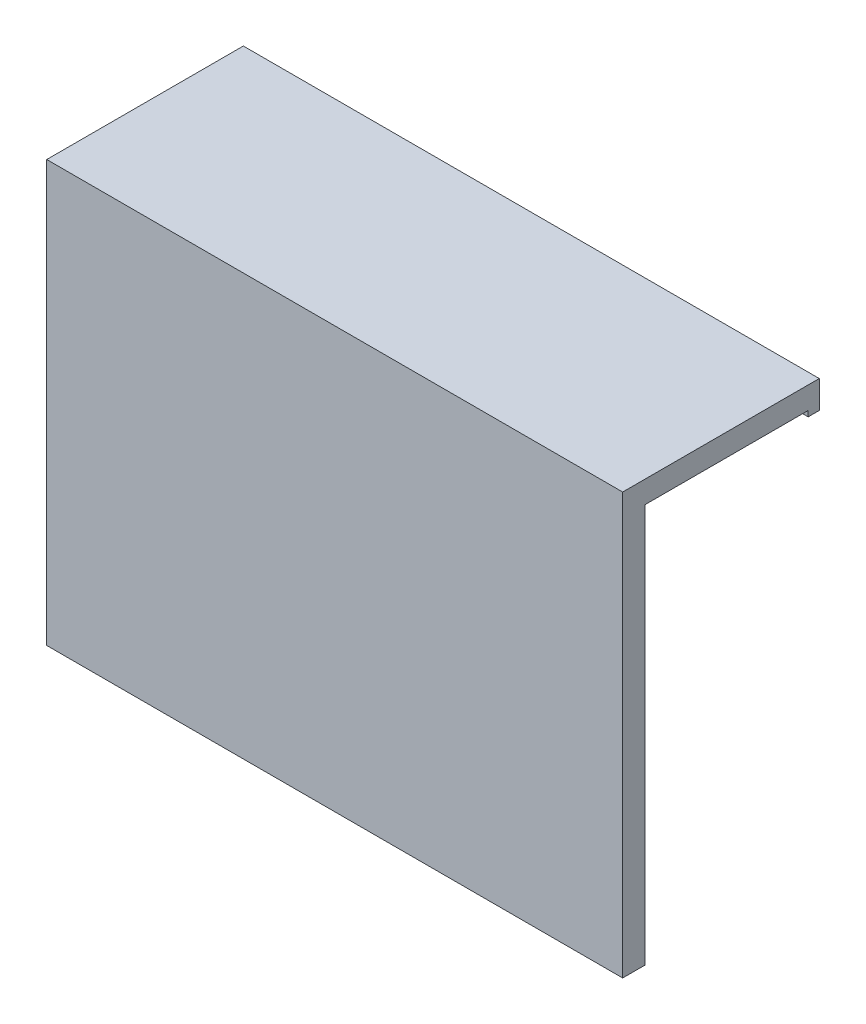
ISO-10303-21;
HEADER;
FILE_DESCRIPTION(('STEP AP214'),'2;1');
FILE_NAME('part.step','',(''),(''),'','','');
FILE_SCHEMA(('AUTOMOTIVE_DESIGN { 1 0 10303 214 1 1 1 1 }'));
ENDSEC;
DATA;
#1=APPLICATION_CONTEXT('core data for automotive mechanical design processes');
#2=APPLICATION_PROTOCOL_DEFINITION('international standard','automotive_design',2000,#1);
#3=PRODUCT_CONTEXT('',#1,'mechanical');
#4=PRODUCT('Part','Part','',(#3));
#5=PRODUCT_RELATED_PRODUCT_CATEGORY('part','',(#4));
#6=PRODUCT_DEFINITION_FORMATION('','',#4);
#7=PRODUCT_DEFINITION_CONTEXT('part definition',#1,'design');
#8=PRODUCT_DEFINITION('design','',#6,#7);
#9=PRODUCT_DEFINITION_SHAPE('','',#8);
#10=(LENGTH_UNIT() NAMED_UNIT(*) SI_UNIT(.MILLI.,.METRE.));
#11=(NAMED_UNIT(*) PLANE_ANGLE_UNIT() SI_UNIT($,.RADIAN.));
#12=(NAMED_UNIT(*) SI_UNIT($,.STERADIAN.) SOLID_ANGLE_UNIT());
#13=UNCERTAINTY_MEASURE_WITH_UNIT(LENGTH_MEASURE(1.E-05),#10,'distance_accuracy_value','');
#14=(GEOMETRIC_REPRESENTATION_CONTEXT(3) GLOBAL_UNCERTAINTY_ASSIGNED_CONTEXT((#13)) GLOBAL_UNIT_ASSIGNED_CONTEXT((#10,
#11,#12)) REPRESENTATION_CONTEXT('',''));
#15=CARTESIAN_POINT('',(0.,0.,0.));
#16=DIRECTION('',(0.,0.,1.));
#17=DIRECTION('',(1.,0.,0.));
#18=AXIS2_PLACEMENT_3D('',#15,#16,#17);
#19=CARTESIAN_POINT('',(0.,0.,-32.5));
#20=DIRECTION('',(0.,0.,-1.));
#21=DIRECTION('',(-1.,0.,0.));
#22=AXIS2_PLACEMENT_3D('',#19,#20,#21);
#23=PLANE('',#22);
#24=DIRECTION('',(0.,1.,0.));
#25=VECTOR('',#24,1.);
#26=CARTESIAN_POINT('',(81.,0.,-32.5));
#27=LINE('',#26,#25);
#28=CARTESIAN_POINT('',(81.,69.8,-32.5));
#29=VERTEX_POINT('',#28);
#30=CARTESIAN_POINT('',(81.,72.,-32.5));
#31=VERTEX_POINT('',#30);
#32=EDGE_CURVE('E190',#29,#31,#27,.T.);
#33=ORIENTED_EDGE('',*,*,#32,.F.);
#34=DIRECTION('',(-1.,0.,0.));
#35=VECTOR('',#34,1.);
#36=CARTESIAN_POINT('',(81.,69.8,-32.5));
#37=LINE('',#36,#35);
#38=CARTESIAN_POINT('',(70.,69.8,-32.5));
#39=VERTEX_POINT('',#38);
#40=EDGE_CURVE('E200',#29,#39,#37,.T.);
#41=ORIENTED_EDGE('',*,*,#40,.T.);
#42=DIRECTION('',(0.,1.,0.));
#43=VECTOR('',#42,1.);
#44=CARTESIAN_POINT('',(70.,0.,-32.5));
#45=LINE('',#44,#43);
#46=CARTESIAN_POINT('',(70.,72.,-32.5));
#47=VERTEX_POINT('',#46);
#48=EDGE_CURVE('E206',#39,#47,#45,.T.);
#49=ORIENTED_EDGE('',*,*,#48,.T.);
#50=DIRECTION('',(-1.,0.,0.));
#51=VECTOR('',#50,1.);
#52=CARTESIAN_POINT('',(0.,72.,-32.5));
#53=LINE('',#52,#51);
#54=CARTESIAN_POINT('',(30.,72.,-32.5));
#55=VERTEX_POINT('',#54);
#56=EDGE_CURVE('E298',#47,#55,#53,.T.);
#57=ORIENTED_EDGE('',*,*,#56,.T.);
#58=DIRECTION('',(0.,1.,0.));
#59=VECTOR('',#58,1.);
#60=CARTESIAN_POINT('',(30.,0.,-32.5));
#61=LINE('',#60,#59);
#62=CARTESIAN_POINT('',(30.,69.8,-32.5));
#63=VERTEX_POINT('',#62);
#64=EDGE_CURVE('E218',#63,#55,#61,.T.);
#65=ORIENTED_EDGE('',*,*,#64,.F.);
#66=DIRECTION('',(1.,0.,0.));
#67=VECTOR('',#66,1.);
#68=CARTESIAN_POINT('',(19.,69.8,-32.5));
#69=LINE('',#68,#67);
#70=CARTESIAN_POINT('',(19.,69.8,-32.5));
#71=VERTEX_POINT('',#70);
#72=EDGE_CURVE('E58',#71,#63,#69,.T.);
#73=ORIENTED_EDGE('',*,*,#72,.F.);
#74=DIRECTION('',(0.,1.,0.));
#75=VECTOR('',#74,1.);
#76=CARTESIAN_POINT('',(19.,0.,-32.5));
#77=LINE('',#76,#75);
#78=CARTESIAN_POINT('',(19.,72.,-32.5));
#79=VERTEX_POINT('',#78);
#80=EDGE_CURVE('E212',#71,#79,#77,.T.);
#81=ORIENTED_EDGE('',*,*,#80,.T.);
#82=CARTESIAN_POINT('',(0.,72.,-32.5));
#83=VERTEX_POINT('',#82);
#84=EDGE_CURVE('E292',#79,#83,#53,.T.);
#85=ORIENTED_EDGE('',*,*,#84,.T.);
#86=DIRECTION('',(0.,-1.,0.));
#87=VECTOR('',#86,1.);
#88=CARTESIAN_POINT('',(0.,70.,-32.5));
#89=LINE('',#88,#87);
#90=CARTESIAN_POINT('',(0.,70.,-32.5));
#91=VERTEX_POINT('',#90);
#92=EDGE_CURVE('E296',#83,#91,#89,.T.);
#93=ORIENTED_EDGE('',*,*,#92,.T.);
#94=DIRECTION('',(-1.,0.,0.));
#95=VECTOR('',#94,1.);
#96=CARTESIAN_POINT('',(-2.,70.,-32.5));
#97=LINE('',#96,#95);
#98=CARTESIAN_POINT('',(-2.,70.,-32.5));
#99=VERTEX_POINT('',#98);
#100=EDGE_CURVE('E302',#91,#99,#97,.T.);
#101=ORIENTED_EDGE('',*,*,#100,.T.);
#102=DIRECTION('',(0.,1.,0.));
#103=VECTOR('',#102,1.);
#104=CARTESIAN_POINT('',(-2.,74.,-32.5));
#105=LINE('',#104,#103);
#106=CARTESIAN_POINT('',(-2.,69.,-32.5));
#107=VERTEX_POINT('',#106);
#108=EDGE_CURVE('E232',#107,#99,#105,.T.);
#109=ORIENTED_EDGE('',*,*,#108,.F.);
#110=DIRECTION('',(-1.,0.,0.));
#111=VECTOR('',#110,1.);
#112=CARTESIAN_POINT('',(102.,69.,-32.5));
#113=LINE('',#112,#111);
#114=CARTESIAN_POINT('',(102.,69.,-32.5));
#115=VERTEX_POINT('',#114);
#116=EDGE_CURVE('E242',#115,#107,#113,.T.);
#117=ORIENTED_EDGE('',*,*,#116,.F.);
#118=DIRECTION('',(0.,-1.,0.));
#119=VECTOR('',#118,1.);
#120=CARTESIAN_POINT('',(102.,74.,-32.5));
#121=LINE('',#120,#119);
#122=CARTESIAN_POINT('',(102.,70.,-32.5));
#123=VERTEX_POINT('',#122);
#124=EDGE_CURVE('E227',#123,#115,#121,.T.);
#125=ORIENTED_EDGE('',*,*,#124,.F.);
#126=DIRECTION('',(-1.,0.,0.));
#127=VECTOR('',#126,1.);
#128=CARTESIAN_POINT('',(100.,70.,-32.5));
#129=LINE('',#128,#127);
#130=CARTESIAN_POINT('',(100.,70.,-32.5));
#131=VERTEX_POINT('',#130);
#132=EDGE_CURVE('E285',#123,#131,#129,.T.);
#133=ORIENTED_EDGE('',*,*,#132,.T.);
#134=DIRECTION('',(0.,1.,0.));
#135=VECTOR('',#134,1.);
#136=CARTESIAN_POINT('',(100.,72.,-32.5));
#137=LINE('',#136,#135);
#138=CARTESIAN_POINT('',(100.,72.,-32.5));
#139=VERTEX_POINT('',#138);
#140=EDGE_CURVE('E288',#131,#139,#137,.T.);
#141=ORIENTED_EDGE('',*,*,#140,.T.);
#142=EDGE_CURVE('E293',#139,#31,#53,.T.);
#143=ORIENTED_EDGE('',*,*,#142,.T.);
#144=EDGE_LOOP('',(#33,#41,#49,#57,#65,#73,#81,#85,#93,#101,#109,#117,#125,#133,#141,#143));
#145=FACE_BOUND('',#144,.T.);
#146=ADVANCED_FACE('F35',(#145),#23,.F.);
#147=CARTESIAN_POINT('',(0.,0.,-3.));
#148=DIRECTION('',(0.,0.,1.));
#149=DIRECTION('',(1.,0.,0.));
#150=AXIS2_PLACEMENT_3D('',#147,#148,#149);
#151=PLANE('',#150);
#152=DIRECTION('',(-1.,0.,0.));
#153=VECTOR('',#152,1.);
#154=CARTESIAN_POINT('',(100.,70.,-3.));
#155=LINE('',#154,#153);
#156=CARTESIAN_POINT('',(102.,70.,-3.));
#157=VERTEX_POINT('',#156);
#158=CARTESIAN_POINT('',(100.,70.,-3.));
#159=VERTEX_POINT('',#158);
#160=EDGE_CURVE('E282',#157,#159,#155,.T.);
#161=ORIENTED_EDGE('',*,*,#160,.F.);
#162=DIRECTION('',(0.,1.,0.));
#163=VECTOR('',#162,1.);
#164=CARTESIAN_POINT('',(102.,0.,-3.));
#165=LINE('',#164,#163);
#166=CARTESIAN_POINT('',(102.,-2.,-3.));
#167=VERTEX_POINT('',#166);
#168=EDGE_CURVE('E328',#167,#157,#165,.T.);
#169=ORIENTED_EDGE('',*,*,#168,.F.);
#170=DIRECTION('',(1.,0.,0.));
#171=VECTOR('',#170,1.);
#172=CARTESIAN_POINT('',(-2.,-2.,-3.));
#173=LINE('',#172,#171);
#174=CARTESIAN_POINT('',(-2.,-2.,-3.));
#175=VERTEX_POINT('',#174);
#176=EDGE_CURVE('E273',#175,#167,#173,.T.);
#177=ORIENTED_EDGE('',*,*,#176,.F.);
#178=DIRECTION('',(0.,1.,0.));
#179=VECTOR('',#178,1.);
#180=CARTESIAN_POINT('',(-2.,0.,-3.));
#181=LINE('',#180,#179);
#182=CARTESIAN_POINT('',(-2.,70.,-3.));
#183=VERTEX_POINT('',#182);
#184=EDGE_CURVE('E331',#175,#183,#181,.T.);
#185=ORIENTED_EDGE('',*,*,#184,.T.);
#186=DIRECTION('',(-1.,0.,0.));
#187=VECTOR('',#186,1.);
#188=CARTESIAN_POINT('',(-2.,70.,-3.));
#189=LINE('',#188,#187);
#190=CARTESIAN_POINT('',(0.,70.,-3.));
#191=VERTEX_POINT('',#190);
#192=EDGE_CURVE('E289',#191,#183,#189,.T.);
#193=ORIENTED_EDGE('',*,*,#192,.F.);
#194=DIRECTION('',(0.,1.,0.));
#195=VECTOR('',#194,1.);
#196=CARTESIAN_POINT('',(0.,0.,-3.));
#197=LINE('',#196,#195);
#198=CARTESIAN_POINT('',(0.,0.,-3.));
#199=VERTEX_POINT('',#198);
#200=EDGE_CURVE('E322',#199,#191,#197,.T.);
#201=ORIENTED_EDGE('',*,*,#200,.F.);
#202=DIRECTION('',(1.,0.,0.));
#203=VECTOR('',#202,1.);
#204=CARTESIAN_POINT('',(-2.,0.,-3.));
#205=LINE('',#204,#203);
#206=CARTESIAN_POINT('',(100.,0.,-3.));
#207=VERTEX_POINT('',#206);
#208=EDGE_CURVE('E269',#199,#207,#205,.T.);
#209=ORIENTED_EDGE('',*,*,#208,.T.);
#210=DIRECTION('',(0.,1.,0.));
#211=VECTOR('',#210,1.);
#212=CARTESIAN_POINT('',(100.,0.,-3.));
#213=LINE('',#212,#211);
#214=EDGE_CURVE('E325',#207,#159,#213,.T.);
#215=ORIENTED_EDGE('',*,*,#214,.T.);
#216=EDGE_LOOP('',(#161,#169,#177,#185,#193,#201,#209,#215));
#217=FACE_BOUND('',#216,.T.);
#218=ADVANCED_FACE('F389',(#217),#151,.F.);
#219=CARTESIAN_POINT('',(102.,0.,1.));
#220=DIRECTION('',(-1.,0.,0.));
#221=DIRECTION('',(0.,0.,1.));
#222=AXIS2_PLACEMENT_3D('',#219,#220,#221);
#223=PLANE('',#222);
#224=DIRECTION('',(0.,1.,0.));
#225=VECTOR('',#224,1.);
#226=CARTESIAN_POINT('',(102.,0.,1.));
#227=LINE('',#226,#225);
#228=CARTESIAN_POINT('',(102.,-2.,1.));
#229=VERTEX_POINT('',#228);
#230=CARTESIAN_POINT('',(102.,74.,1.));
#231=VERTEX_POINT('',#230);
#232=EDGE_CURVE('E350',#229,#231,#227,.T.);
#233=ORIENTED_EDGE('',*,*,#232,.F.);
#234=DIRECTION('',(0.,0.,1.));
#235=VECTOR('',#234,1.);
#236=CARTESIAN_POINT('',(102.,-2.,1.));
#237=LINE('',#236,#235);
#238=EDGE_CURVE('E276',#167,#229,#237,.T.);
#239=ORIENTED_EDGE('',*,*,#238,.F.);
#240=ORIENTED_EDGE('',*,*,#168,.T.);
#241=DIRECTION('',(0.,0.,1.));
#242=VECTOR('',#241,1.);
#243=CARTESIAN_POINT('',(102.,70.,-32.5));
#244=LINE('',#243,#242);
#245=EDGE_CURVE('E318',#123,#157,#244,.T.);
#246=ORIENTED_EDGE('',*,*,#245,.F.);
#247=ORIENTED_EDGE('',*,*,#124,.T.);
#248=DIRECTION('',(0.,0.,1.));
#249=VECTOR('',#248,1.);
#250=CARTESIAN_POINT('',(102.,69.,-34.5));
#251=LINE('',#250,#249);
#252=CARTESIAN_POINT('',(102.,69.,-34.5));
#253=VERTEX_POINT('',#252);
#254=EDGE_CURVE('E248',#253,#115,#251,.T.);
#255=ORIENTED_EDGE('',*,*,#254,.F.);
#256=DIRECTION('',(0.,-1.,0.));
#257=VECTOR('',#256,1.);
#258=CARTESIAN_POINT('',(102.,74.,-34.5));
#259=LINE('',#258,#257);
#260=CARTESIAN_POINT('',(102.,74.,-34.5));
#261=VERTEX_POINT('',#260);
#262=EDGE_CURVE('E228',#261,#253,#259,.T.);
#263=ORIENTED_EDGE('',*,*,#262,.F.);
#264=DIRECTION('',(0.,0.,-1.));
#265=VECTOR('',#264,1.);
#266=CARTESIAN_POINT('',(102.,74.,1.));
#267=LINE('',#266,#265);
#268=EDGE_CURVE('E11',#231,#261,#267,.T.);
#269=ORIENTED_EDGE('',*,*,#268,.F.);
#270=EDGE_LOOP('',(#233,#239,#240,#246,#247,#255,#263,#269));
#271=FACE_BOUND('',#270,.T.);
#272=ADVANCED_FACE('F37',(#271),#223,.F.);
#273=CARTESIAN_POINT('',(0.,74.,1.));
#274=DIRECTION('',(0.,1.,0.));
#275=DIRECTION('',(0.,0.,1.));
#276=AXIS2_PLACEMENT_3D('',#273,#274,#275);
#277=PLANE('',#276);
#278=ORIENTED_EDGE('',*,*,#268,.T.);
#279=DIRECTION('',(1.,0.,0.));
#280=VECTOR('',#279,1.);
#281=CARTESIAN_POINT('',(102.,74.,-34.5));
#282=LINE('',#281,#280);
#283=CARTESIAN_POINT('',(-2.,74.,-34.5));
#284=VERTEX_POINT('',#283);
#285=EDGE_CURVE('E237',#284,#261,#282,.T.);
#286=ORIENTED_EDGE('',*,*,#285,.F.);
#287=DIRECTION('',(0.,0.,-1.));
#288=VECTOR('',#287,1.);
#289=CARTESIAN_POINT('',(-2.,74.,1.));
#290=LINE('',#289,#288);
#291=CARTESIAN_POINT('',(-2.,74.,1.));
#292=VERTEX_POINT('',#291);
#293=EDGE_CURVE('E43',#292,#284,#290,.T.);
#294=ORIENTED_EDGE('',*,*,#293,.F.);
#295=DIRECTION('',(1.,0.,0.));
#296=VECTOR('',#295,1.);
#297=CARTESIAN_POINT('',(0.,74.,1.));
#298=LINE('',#297,#296);
#299=EDGE_CURVE('E352',#292,#231,#298,.T.);
#300=ORIENTED_EDGE('',*,*,#299,.T.);
#301=EDGE_LOOP('',(#278,#286,#294,#300));
#302=FACE_BOUND('',#301,.T.);
#303=ADVANCED_FACE('F371',(#302),#277,.T.);
#304=CARTESIAN_POINT('',(-2.,0.,1.));
#305=DIRECTION('',(-1.,0.,0.));
#306=DIRECTION('',(0.,0.,1.));
#307=AXIS2_PLACEMENT_3D('',#304,#305,#306);
#308=PLANE('',#307);
#309=ORIENTED_EDGE('',*,*,#293,.T.);
#310=DIRECTION('',(0.,1.,0.));
#311=VECTOR('',#310,1.);
#312=CARTESIAN_POINT('',(-2.,74.,-34.5));
#313=LINE('',#312,#311);
#314=CARTESIAN_POINT('',(-2.,69.,-34.5));
#315=VERTEX_POINT('',#314);
#316=EDGE_CURVE('E234',#315,#284,#313,.T.);
#317=ORIENTED_EDGE('',*,*,#316,.F.);
#318=DIRECTION('',(0.,0.,1.));
#319=VECTOR('',#318,1.);
#320=CARTESIAN_POINT('',(-2.,69.,-34.5));
#321=LINE('',#320,#319);
#322=EDGE_CURVE('E240',#315,#107,#321,.T.);
#323=ORIENTED_EDGE('',*,*,#322,.T.);
#324=ORIENTED_EDGE('',*,*,#108,.T.);
#325=DIRECTION('',(0.,0.,1.));
#326=VECTOR('',#325,1.);
#327=CARTESIAN_POINT('',(-2.,70.,-32.5));
#328=LINE('',#327,#326);
#329=EDGE_CURVE('E305',#99,#183,#328,.T.);
#330=ORIENTED_EDGE('',*,*,#329,.T.);
#331=ORIENTED_EDGE('',*,*,#184,.F.);
#332=DIRECTION('',(0.,0.,-1.));
#333=VECTOR('',#332,1.);
#334=CARTESIAN_POINT('',(-2.,-2.,1.));
#335=LINE('',#334,#333);
#336=CARTESIAN_POINT('',(-2.,-2.,1.));
#337=VERTEX_POINT('',#336);
#338=EDGE_CURVE('E270',#337,#175,#335,.T.);
#339=ORIENTED_EDGE('',*,*,#338,.F.);
#340=DIRECTION('',(0.,1.,0.));
#341=VECTOR('',#340,1.);
#342=CARTESIAN_POINT('',(-2.,0.,1.));
#343=LINE('',#342,#341);
#344=EDGE_CURVE('E356',#337,#292,#343,.T.);
#345=ORIENTED_EDGE('',*,*,#344,.T.);
#346=EDGE_LOOP('',(#309,#317,#323,#324,#330,#331,#339,#345));
#347=FACE_BOUND('',#346,.T.);
#348=ADVANCED_FACE('F362',(#347),#308,.T.);
#349=CARTESIAN_POINT('',(0.,0.,1.));
#350=DIRECTION('',(0.,0.,1.));
#351=DIRECTION('',(1.,0.,0.));
#352=AXIS2_PLACEMENT_3D('',#349,#350,#351);
#353=PLANE('',#352);
#354=ORIENTED_EDGE('',*,*,#344,.F.);
#355=DIRECTION('',(-1.,0.,0.));
#356=VECTOR('',#355,1.);
#357=CARTESIAN_POINT('',(-2.,-2.,1.));
#358=LINE('',#357,#356);
#359=EDGE_CURVE('E279',#229,#337,#358,.T.);
#360=ORIENTED_EDGE('',*,*,#359,.F.);
#361=ORIENTED_EDGE('',*,*,#232,.T.);
#362=ORIENTED_EDGE('',*,*,#299,.F.);
#363=EDGE_LOOP('',(#354,#360,#361,#362));
#364=FACE_BOUND('',#363,.T.);
#365=ADVANCED_FACE('F394',(#364),#353,.T.);
#366=CARTESIAN_POINT('',(0.,0.,0.));
#367=DIRECTION('',(0.,0.,1.));
#368=DIRECTION('',(1.,0.,0.));
#369=AXIS2_PLACEMENT_3D('',#366,#367,#368);
#370=PLANE('',#369);
#371=DIRECTION('',(1.,0.,0.));
#372=VECTOR('',#371,1.);
#373=CARTESIAN_POINT('',(0.,0.,0.));
#374=LINE('',#373,#372);
#375=CARTESIAN_POINT('',(0.,0.,0.));
#376=VERTEX_POINT('',#375);
#377=CARTESIAN_POINT('',(39.,0.,0.));
#378=VERTEX_POINT('',#377);
#379=EDGE_CURVE('E353',#376,#378,#374,.T.);
#380=ORIENTED_EDGE('',*,*,#379,.F.);
#381=DIRECTION('',(0.,1.,0.));
#382=VECTOR('',#381,1.);
#383=CARTESIAN_POINT('',(0.,0.,0.));
#384=LINE('',#383,#382);
#385=CARTESIAN_POINT('',(0.,72.,0.));
#386=VERTEX_POINT('',#385);
#387=EDGE_CURVE('E321',#376,#386,#384,.T.);
#388=ORIENTED_EDGE('',*,*,#387,.T.);
#389=DIRECTION('',(1.,0.,0.));
#390=VECTOR('',#389,1.);
#391=CARTESIAN_POINT('',(0.,72.,0.));
#392=LINE('',#391,#390);
#393=CARTESIAN_POINT('',(100.,72.,0.));
#394=VERTEX_POINT('',#393);
#395=EDGE_CURVE('E335',#386,#394,#392,.T.);
#396=ORIENTED_EDGE('',*,*,#395,.T.);
#397=DIRECTION('',(0.,1.,0.));
#398=VECTOR('',#397,1.);
#399=CARTESIAN_POINT('',(100.,0.,0.));
#400=LINE('',#399,#398);
#401=CARTESIAN_POINT('',(100.,0.,0.));
#402=VERTEX_POINT('',#401);
#403=EDGE_CURVE('E326',#402,#394,#400,.T.);
#404=ORIENTED_EDGE('',*,*,#403,.F.);
#405=CARTESIAN_POINT('',(61.,0.,0.));
#406=VERTEX_POINT('',#405);
#407=EDGE_CURVE('E342',#406,#402,#374,.T.);
#408=ORIENTED_EDGE('',*,*,#407,.F.);
#409=DIRECTION('',(1.,0.,0.));
#410=VECTOR('',#409,1.);
#411=CARTESIAN_POINT('',(39.,0.,0.));
#412=LINE('',#411,#410);
#413=EDGE_CURVE('E266',#378,#406,#412,.T.);
#414=ORIENTED_EDGE('',*,*,#413,.F.);
#415=EDGE_LOOP('',(#380,#388,#396,#404,#408,#414));
#416=FACE_BOUND('',#415,.T.);
#417=ADVANCED_FACE('F396',(#416),#370,.F.);
#418=CARTESIAN_POINT('',(100.,0.,-3.));
#419=DIRECTION('',(1.,0.,0.));
#420=DIRECTION('',(0.,0.,-1.));
#421=AXIS2_PLACEMENT_3D('',#418,#419,#420);
#422=PLANE('',#421);
#423=ORIENTED_EDGE('',*,*,#403,.T.);
#424=DIRECTION('',(0.,0.,1.));
#425=VECTOR('',#424,1.);
#426=CARTESIAN_POINT('',(100.,72.,-3.));
#427=LINE('',#426,#425);
#428=EDGE_CURVE('E343',#139,#394,#427,.T.);
#429=ORIENTED_EDGE('',*,*,#428,.F.);
#430=ORIENTED_EDGE('',*,*,#140,.F.);
#431=DIRECTION('',(0.,0.,1.));
#432=VECTOR('',#431,1.);
#433=CARTESIAN_POINT('',(100.,70.,-32.5));
#434=LINE('',#433,#432);
#435=EDGE_CURVE('E315',#131,#159,#434,.T.);
#436=ORIENTED_EDGE('',*,*,#435,.T.);
#437=ORIENTED_EDGE('',*,*,#214,.F.);
#438=DIRECTION('',(0.,0.,1.));
#439=VECTOR('',#438,1.);
#440=CARTESIAN_POINT('',(100.,0.,-3.));
#441=LINE('',#440,#439);
#442=EDGE_CURVE('E339',#207,#402,#441,.T.);
#443=ORIENTED_EDGE('',*,*,#442,.T.);
#444=EDGE_LOOP('',(#423,#429,#430,#436,#437,#443));
#445=FACE_BOUND('',#444,.T.);
#446=ADVANCED_FACE('F402',(#445),#422,.F.);
#447=CARTESIAN_POINT('',(0.,72.,-3.));
#448=DIRECTION('',(0.,-1.,0.));
#449=DIRECTION('',(0.,0.,-1.));
#450=AXIS2_PLACEMENT_3D('',#447,#448,#449);
#451=PLANE('',#450);
#452=ORIENTED_EDGE('',*,*,#395,.F.);
#453=DIRECTION('',(0.,0.,1.));
#454=VECTOR('',#453,1.);
#455=CARTESIAN_POINT('',(0.,72.,-3.));
#456=LINE('',#455,#454);
#457=EDGE_CURVE('E346',#83,#386,#456,.T.);
#458=ORIENTED_EDGE('',*,*,#457,.F.);
#459=ORIENTED_EDGE('',*,*,#84,.F.);
#460=EDGE_CURVE('E299',#55,#79,#53,.T.);
#461=ORIENTED_EDGE('',*,*,#460,.F.);
#462=ORIENTED_EDGE('',*,*,#56,.F.);
#463=EDGE_CURVE('E297',#31,#47,#53,.T.);
#464=ORIENTED_EDGE('',*,*,#463,.F.);
#465=ORIENTED_EDGE('',*,*,#142,.F.);
#466=ORIENTED_EDGE('',*,*,#428,.T.);
#467=EDGE_LOOP('',(#452,#458,#459,#461,#462,#464,#465,#466));
#468=FACE_BOUND('',#467,.T.);
#469=ADVANCED_FACE('F445',(#468),#451,.T.);
#470=CARTESIAN_POINT('',(0.,0.,-3.));
#471=DIRECTION('',(1.,0.,0.));
#472=DIRECTION('',(0.,0.,-1.));
#473=AXIS2_PLACEMENT_3D('',#470,#471,#472);
#474=PLANE('',#473);
#475=ORIENTED_EDGE('',*,*,#387,.F.);
#476=DIRECTION('',(0.,0.,1.));
#477=VECTOR('',#476,1.);
#478=CARTESIAN_POINT('',(0.,0.,-3.));
#479=LINE('',#478,#477);
#480=EDGE_CURVE('E333',#199,#376,#479,.T.);
#481=ORIENTED_EDGE('',*,*,#480,.F.);
#482=ORIENTED_EDGE('',*,*,#200,.T.);
#483=DIRECTION('',(0.,0.,1.));
#484=VECTOR('',#483,1.);
#485=CARTESIAN_POINT('',(0.,70.,-32.5));
#486=LINE('',#485,#484);
#487=EDGE_CURVE('E312',#91,#191,#486,.T.);
#488=ORIENTED_EDGE('',*,*,#487,.F.);
#489=ORIENTED_EDGE('',*,*,#92,.F.);
#490=ORIENTED_EDGE('',*,*,#457,.T.);
#491=EDGE_LOOP('',(#475,#481,#482,#488,#489,#490));
#492=FACE_BOUND('',#491,.T.);
#493=ADVANCED_FACE('F440',(#492),#474,.T.);
#494=CARTESIAN_POINT('',(100.,70.,-32.5));
#495=DIRECTION('',(0.,1.,0.));
#496=DIRECTION('',(0.,0.,1.));
#497=AXIS2_PLACEMENT_3D('',#494,#495,#496);
#498=PLANE('',#497);
#499=ORIENTED_EDGE('',*,*,#160,.T.);
#500=ORIENTED_EDGE('',*,*,#435,.F.);
#501=ORIENTED_EDGE('',*,*,#132,.F.);
#502=ORIENTED_EDGE('',*,*,#245,.T.);
#503=EDGE_LOOP('',(#499,#500,#501,#502));
#504=FACE_BOUND('',#503,.T.);
#505=ADVANCED_FACE('F438',(#504),#498,.F.);
#506=CARTESIAN_POINT('',(-2.,70.,-32.5));
#507=DIRECTION('',(0.,1.,0.));
#508=DIRECTION('',(0.,0.,1.));
#509=AXIS2_PLACEMENT_3D('',#506,#507,#508);
#510=PLANE('',#509);
#511=ORIENTED_EDGE('',*,*,#192,.T.);
#512=ORIENTED_EDGE('',*,*,#329,.F.);
#513=ORIENTED_EDGE('',*,*,#100,.F.);
#514=ORIENTED_EDGE('',*,*,#487,.T.);
#515=EDGE_LOOP('',(#511,#512,#513,#514));
#516=FACE_BOUND('',#515,.T.);
#517=ADVANCED_FACE('F386',(#516),#510,.F.);
#518=CARTESIAN_POINT('',(0.,0.,0.));
#519=DIRECTION('',(0.,-1.,0.));
#520=DIRECTION('',(0.,0.,-1.));
#521=AXIS2_PLACEMENT_3D('',#518,#519,#520);
#522=PLANE('',#521);
#523=ORIENTED_EDGE('',*,*,#379,.T.);
#524=DIRECTION('',(0.,0.,1.));
#525=VECTOR('',#524,1.);
#526=CARTESIAN_POINT('',(39.,0.,0.));
#527=LINE('',#526,#525);
#528=CARTESIAN_POINT('',(39.,0.,-2.4));
#529=VERTEX_POINT('',#528);
#530=EDGE_CURVE('E260',#529,#378,#527,.T.);
#531=ORIENTED_EDGE('',*,*,#530,.F.);
#532=DIRECTION('',(1.,0.,0.));
#533=VECTOR('',#532,1.);
#534=CARTESIAN_POINT('',(39.,0.,-2.4));
#535=LINE('',#534,#533);
#536=CARTESIAN_POINT('',(61.,0.,-2.4));
#537=VERTEX_POINT('',#536);
#538=EDGE_CURVE('E263',#529,#537,#535,.T.);
#539=ORIENTED_EDGE('',*,*,#538,.T.);
#540=DIRECTION('',(0.,0.,1.));
#541=VECTOR('',#540,1.);
#542=CARTESIAN_POINT('',(61.,0.,0.));
#543=LINE('',#542,#541);
#544=EDGE_CURVE('E254',#537,#406,#543,.T.);
#545=ORIENTED_EDGE('',*,*,#544,.T.);
#546=ORIENTED_EDGE('',*,*,#407,.T.);
#547=ORIENTED_EDGE('',*,*,#442,.F.);
#548=ORIENTED_EDGE('',*,*,#208,.F.);
#549=ORIENTED_EDGE('',*,*,#480,.T.);
#550=EDGE_LOOP('',(#523,#531,#539,#545,#546,#547,#548,#549));
#551=FACE_BOUND('',#550,.T.);
#552=ADVANCED_FACE('F432',(#551),#522,.F.);
#553=CARTESIAN_POINT('',(0.,-2.,0.));
#554=DIRECTION('',(0.,-1.,0.));
#555=DIRECTION('',(0.,0.,-1.));
#556=AXIS2_PLACEMENT_3D('',#553,#554,#555);
#557=PLANE('',#556);
#558=ORIENTED_EDGE('',*,*,#338,.T.);
#559=ORIENTED_EDGE('',*,*,#176,.T.);
#560=ORIENTED_EDGE('',*,*,#238,.T.);
#561=ORIENTED_EDGE('',*,*,#359,.T.);
#562=EDGE_LOOP('',(#558,#559,#560,#561));
#563=FACE_BOUND('',#562,.T.);
#564=ADVANCED_FACE('F391',(#563),#557,.T.);
#565=CARTESIAN_POINT('',(39.,0.,-1.2));
#566=DIRECTION('',(1.,0.,0.));
#567=DIRECTION('',(0.,0.,-1.));
#568=AXIS2_PLACEMENT_3D('',#565,#566,#567);
#569=CYLINDRICAL_SURFACE('',#568,1.2);
#570=ORIENTED_EDGE('',*,*,#538,.F.);
#571=CARTESIAN_POINT('',(39.,0.,-1.2));
#572=DIRECTION('',(-1.,0.,0.));
#573=DIRECTION('',(0.,0.,1.));
#574=AXIS2_PLACEMENT_3D('',#571,#572,#573);
#575=CIRCLE('',#574,1.2);
#576=EDGE_CURVE('E257',#378,#529,#575,.F.);
#577=ORIENTED_EDGE('',*,*,#576,.F.);
#578=ORIENTED_EDGE('',*,*,#413,.T.);
#579=CARTESIAN_POINT('',(61.,0.,-1.2));
#580=DIRECTION('',(-1.,0.,0.));
#581=DIRECTION('',(0.,0.,1.));
#582=AXIS2_PLACEMENT_3D('',#579,#580,#581);
#583=CIRCLE('',#582,1.2);
#584=EDGE_CURVE('E251',#406,#537,#583,.F.);
#585=ORIENTED_EDGE('',*,*,#584,.T.);
#586=EDGE_LOOP('',(#570,#577,#578,#585));
#587=FACE_BOUND('',#586,.T.);
#588=ADVANCED_FACE('F425',(#587),#569,.F.);
#589=CARTESIAN_POINT('',(39.,0.,0.));
#590=DIRECTION('',(-1.,0.,0.));
#591=DIRECTION('',(0.,0.,1.));
#592=AXIS2_PLACEMENT_3D('',#589,#590,#591);
#593=PLANE('',#592);
#594=ORIENTED_EDGE('',*,*,#576,.T.);
#595=ORIENTED_EDGE('',*,*,#530,.T.);
#596=EDGE_LOOP('',(#594,#595));
#597=FACE_BOUND('',#596,.T.);
#598=ADVANCED_FACE('F421',(#597),#593,.F.);
#599=CARTESIAN_POINT('',(61.,0.,0.));
#600=DIRECTION('',(-1.,0.,0.));
#601=DIRECTION('',(0.,0.,1.));
#602=AXIS2_PLACEMENT_3D('',#599,#600,#601);
#603=PLANE('',#602);
#604=ORIENTED_EDGE('',*,*,#584,.F.);
#605=ORIENTED_EDGE('',*,*,#544,.F.);
#606=EDGE_LOOP('',(#604,#605));
#607=FACE_BOUND('',#606,.T.);
#608=ADVANCED_FACE('F418',(#607),#603,.T.);
#609=CARTESIAN_POINT('',(102.,69.,-34.5));
#610=DIRECTION('',(0.,1.,0.));
#611=DIRECTION('',(0.,0.,1.));
#612=AXIS2_PLACEMENT_3D('',#609,#610,#611);
#613=PLANE('',#612);
#614=ORIENTED_EDGE('',*,*,#116,.T.);
#615=ORIENTED_EDGE('',*,*,#322,.F.);
#616=DIRECTION('',(-1.,0.,0.));
#617=VECTOR('',#616,1.);
#618=CARTESIAN_POINT('',(102.,69.,-34.5));
#619=LINE('',#618,#617);
#620=EDGE_CURVE('E231',#253,#315,#619,.T.);
#621=ORIENTED_EDGE('',*,*,#620,.F.);
#622=ORIENTED_EDGE('',*,*,#254,.T.);
#623=EDGE_LOOP('',(#614,#615,#621,#622));
#624=FACE_BOUND('',#623,.T.);
#625=ADVANCED_FACE('F380',(#624),#613,.F.);
#626=CARTESIAN_POINT('',(0.,0.,-34.5));
#627=DIRECTION('',(0.,0.,-1.));
#628=DIRECTION('',(-1.,0.,0.));
#629=AXIS2_PLACEMENT_3D('',#626,#627,#628);
#630=PLANE('',#629);
#631=ORIENTED_EDGE('',*,*,#262,.T.);
#632=ORIENTED_EDGE('',*,*,#620,.T.);
#633=ORIENTED_EDGE('',*,*,#316,.T.);
#634=ORIENTED_EDGE('',*,*,#285,.T.);
#635=EDGE_LOOP('',(#631,#632,#633,#634));
#636=FACE_BOUND('',#635,.T.);
#637=ADVANCED_FACE('F368',(#636),#630,.T.);
#638=CARTESIAN_POINT('',(19.,0.,-32.5));
#639=DIRECTION('',(0.,0.,-1.));
#640=DIRECTION('',(-1.,0.,0.));
#641=AXIS2_PLACEMENT_3D('',#638,#639,#640);
#642=PLANE('',#641);
#643=CARTESIAN_POINT('',(19.,72.2,-32.5));
#644=VERTEX_POINT('',#643);
#645=EDGE_CURVE('E216',#79,#644,#77,.T.);
#646=ORIENTED_EDGE('',*,*,#645,.T.);
#647=DIRECTION('',(1.,0.,0.));
#648=VECTOR('',#647,1.);
#649=CARTESIAN_POINT('',(19.,72.2,-32.5));
#650=LINE('',#649,#648);
#651=CARTESIAN_POINT('',(30.,72.2,-32.5));
#652=VERTEX_POINT('',#651);
#653=EDGE_CURVE('E224',#644,#652,#650,.T.);
#654=ORIENTED_EDGE('',*,*,#653,.T.);
#655=EDGE_CURVE('E210',#55,#652,#61,.T.);
#656=ORIENTED_EDGE('',*,*,#655,.F.);
#657=ORIENTED_EDGE('',*,*,#460,.T.);
#658=EDGE_LOOP('',(#646,#654,#656,#657));
#659=FACE_BOUND('',#658,.T.);
#660=ADVANCED_FACE('F472',(#659),#642,.T.);
#661=CARTESIAN_POINT('',(19.,71.,-32.5));
#662=DIRECTION('',(1.,0.,0.));
#663=DIRECTION('',(0.,0.,-1.));
#664=AXIS2_PLACEMENT_3D('',#661,#662,#663);
#665=CYLINDRICAL_SURFACE('',#664,1.20000000000001);
#666=CARTESIAN_POINT('',(30.,71.,-32.5));
#667=DIRECTION('',(-1.,0.,0.));
#668=DIRECTION('',(0.,0.,1.));
#669=AXIS2_PLACEMENT_3D('',#666,#667,#668);
#670=CIRCLE('',#669,1.20000000000001);
#671=EDGE_CURVE('E221',#652,#63,#670,.T.);
#672=ORIENTED_EDGE('',*,*,#671,.F.);
#673=ORIENTED_EDGE('',*,*,#653,.F.);
#674=CARTESIAN_POINT('',(19.,71.,-32.5));
#675=DIRECTION('',(-1.,0.,0.));
#676=DIRECTION('',(0.,0.,1.));
#677=AXIS2_PLACEMENT_3D('',#674,#675,#676);
#678=CIRCLE('',#677,1.20000000000001);
#679=EDGE_CURVE('E215',#644,#71,#678,.T.);
#680=ORIENTED_EDGE('',*,*,#679,.T.);
#681=ORIENTED_EDGE('',*,*,#72,.T.);
#682=EDGE_LOOP('',(#672,#673,#680,#681));
#683=FACE_BOUND('',#682,.T.);
#684=ADVANCED_FACE('F481',(#683),#665,.F.);
#685=CARTESIAN_POINT('',(19.,0.,0.));
#686=DIRECTION('',(-1.,0.,0.));
#687=DIRECTION('',(0.,0.,1.));
#688=AXIS2_PLACEMENT_3D('',#685,#686,#687);
#689=PLANE('',#688);
#690=ORIENTED_EDGE('',*,*,#80,.F.);
#691=ORIENTED_EDGE('',*,*,#679,.F.);
#692=ORIENTED_EDGE('',*,*,#645,.F.);
#693=EDGE_LOOP('',(#690,#691,#692));
#694=FACE_BOUND('',#693,.T.);
#695=ADVANCED_FACE('F476',(#694),#689,.F.);
#696=CARTESIAN_POINT('',(30.,0.,0.));
#697=DIRECTION('',(-1.,0.,0.));
#698=DIRECTION('',(0.,0.,1.));
#699=AXIS2_PLACEMENT_3D('',#696,#697,#698);
#700=PLANE('',#699);
#701=ORIENTED_EDGE('',*,*,#64,.T.);
#702=ORIENTED_EDGE('',*,*,#655,.T.);
#703=ORIENTED_EDGE('',*,*,#671,.T.);
#704=EDGE_LOOP('',(#701,#702,#703));
#705=FACE_BOUND('',#704,.T.);
#706=ADVANCED_FACE('F480',(#705),#700,.T.);
#707=CARTESIAN_POINT('',(81.,0.,-32.5));
#708=DIRECTION('',(0.,0.,1.));
#709=DIRECTION('',(1.,0.,0.));
#710=AXIS2_PLACEMENT_3D('',#707,#708,#709);
#711=PLANE('',#710);
#712=ORIENTED_EDGE('',*,*,#463,.T.);
#713=CARTESIAN_POINT('',(70.,72.2,-32.5));
#714=VERTEX_POINT('',#713);
#715=EDGE_CURVE('E50',#47,#714,#45,.T.);
#716=ORIENTED_EDGE('',*,*,#715,.T.);
#717=DIRECTION('',(-1.,0.,0.));
#718=VECTOR('',#717,1.);
#719=CARTESIAN_POINT('',(81.,72.2,-32.5));
#720=LINE('',#719,#718);
#721=CARTESIAN_POINT('',(81.,72.2,-32.5));
#722=VERTEX_POINT('',#721);
#723=EDGE_CURVE('E196',#722,#714,#720,.T.);
#724=ORIENTED_EDGE('',*,*,#723,.F.);
#725=EDGE_CURVE('E184',#31,#722,#27,.T.);
#726=ORIENTED_EDGE('',*,*,#725,.F.);
#727=EDGE_LOOP('',(#712,#716,#724,#726));
#728=FACE_BOUND('',#727,.T.);
#729=ADVANCED_FACE('F197',(#728),#711,.F.);
#730=CARTESIAN_POINT('',(81.,71.,-32.5));
#731=DIRECTION('',(-1.,0.,0.));
#732=DIRECTION('',(0.,0.,1.));
#733=AXIS2_PLACEMENT_3D('',#730,#731,#732);
#734=CYLINDRICAL_SURFACE('',#733,1.20000000000001);
#735=CARTESIAN_POINT('',(70.,71.,-32.5));
#736=DIRECTION('',(-1.,0.,0.));
#737=DIRECTION('',(0.,0.,1.));
#738=AXIS2_PLACEMENT_3D('',#735,#736,#737);
#739=CIRCLE('',#738,1.20000000000001);
#740=EDGE_CURVE('E193',#714,#39,#739,.T.);
#741=ORIENTED_EDGE('',*,*,#740,.T.);
#742=ORIENTED_EDGE('',*,*,#40,.F.);
#743=CARTESIAN_POINT('',(81.,71.,-32.5));
#744=DIRECTION('',(-1.,0.,0.));
#745=DIRECTION('',(0.,0.,1.));
#746=AXIS2_PLACEMENT_3D('',#743,#744,#745);
#747=CIRCLE('',#746,1.20000000000001);
#748=EDGE_CURVE('E188',#722,#29,#747,.T.);
#749=ORIENTED_EDGE('',*,*,#748,.F.);
#750=ORIENTED_EDGE('',*,*,#723,.T.);
#751=EDGE_LOOP('',(#741,#742,#749,#750));
#752=FACE_BOUND('',#751,.T.);
#753=ADVANCED_FACE('F202',(#752),#734,.F.);
#754=CARTESIAN_POINT('',(81.,0.,0.));
#755=DIRECTION('',(-1.,0.,0.));
#756=DIRECTION('',(0.,0.,1.));
#757=AXIS2_PLACEMENT_3D('',#754,#755,#756);
#758=PLANE('',#757);
#759=ORIENTED_EDGE('',*,*,#32,.T.);
#760=ORIENTED_EDGE('',*,*,#725,.T.);
#761=ORIENTED_EDGE('',*,*,#748,.T.);
#762=EDGE_LOOP('',(#759,#760,#761));
#763=FACE_BOUND('',#762,.T.);
#764=ADVANCED_FACE('F186',(#763),#758,.T.);
#765=CARTESIAN_POINT('',(70.,0.,0.));
#766=DIRECTION('',(-1.,0.,0.));
#767=DIRECTION('',(0.,0.,1.));
#768=AXIS2_PLACEMENT_3D('',#765,#766,#767);
#769=PLANE('',#768);
#770=ORIENTED_EDGE('',*,*,#48,.F.);
#771=ORIENTED_EDGE('',*,*,#740,.F.);
#772=ORIENTED_EDGE('',*,*,#715,.F.);
#773=EDGE_LOOP('',(#770,#771,#772));
#774=FACE_BOUND('',#773,.T.);
#775=ADVANCED_FACE('F496',(#774),#769,.F.);
#776=CLOSED_SHELL('',(#146,#218,#272,#303,#348,#365,#417,#446,#469,#493,#505,#517,#552,#564,
#588,#598,#608,#625,#637,#660,#684,#695,#706,#729,#753,#764,#775));
#777=MANIFOLD_SOLID_BREP('B2',#776);
#778=ADVANCED_BREP_SHAPE_REPRESENTATION('',(#18,#777),#14);
#779=SHAPE_DEFINITION_REPRESENTATION(#9,#778);
ENDSEC;
END-ISO-10303-21;
